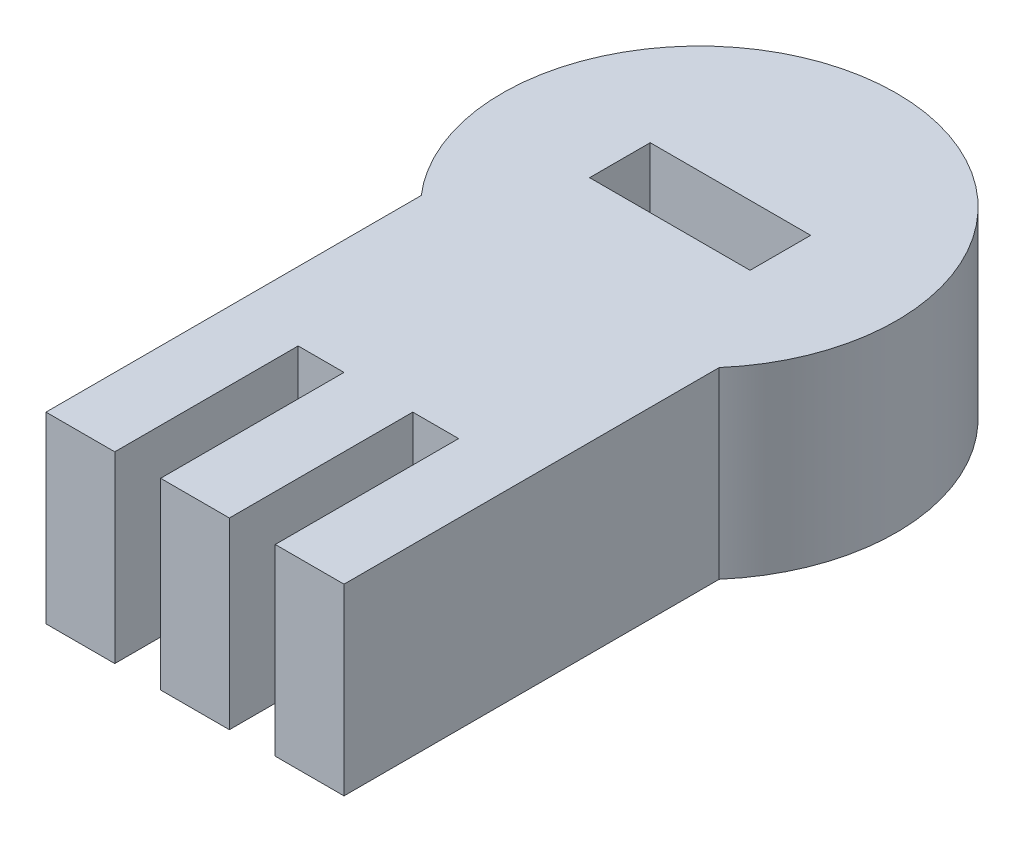
ISO-10303-21;
HEADER;
FILE_DESCRIPTION(('STEP AP214'),'2;1');
FILE_NAME('part.step','',(''),(''),'','','');
FILE_SCHEMA(('AUTOMOTIVE_DESIGN { 1 0 10303 214 1 1 1 1 }'));
ENDSEC;
DATA;
#1=APPLICATION_CONTEXT('core data for automotive mechanical design processes');
#2=APPLICATION_PROTOCOL_DEFINITION('international standard','automotive_design',2000,#1);
#3=PRODUCT_CONTEXT('',#1,'mechanical');
#4=PRODUCT('Part','Part','',(#3));
#5=PRODUCT_RELATED_PRODUCT_CATEGORY('part','',(#4));
#6=PRODUCT_DEFINITION_FORMATION('','',#4);
#7=PRODUCT_DEFINITION_CONTEXT('part definition',#1,'design');
#8=PRODUCT_DEFINITION('design','',#6,#7);
#9=PRODUCT_DEFINITION_SHAPE('','',#8);
#10=(LENGTH_UNIT() NAMED_UNIT(*) SI_UNIT(.MILLI.,.METRE.));
#11=(NAMED_UNIT(*) PLANE_ANGLE_UNIT() SI_UNIT($,.RADIAN.));
#12=(NAMED_UNIT(*) SI_UNIT($,.STERADIAN.) SOLID_ANGLE_UNIT());
#13=UNCERTAINTY_MEASURE_WITH_UNIT(LENGTH_MEASURE(1.E-05),#10,'distance_accuracy_value','');
#14=(GEOMETRIC_REPRESENTATION_CONTEXT(3) GLOBAL_UNCERTAINTY_ASSIGNED_CONTEXT((#13)) GLOBAL_UNIT_ASSIGNED_CONTEXT((#10,
#11,#12)) REPRESENTATION_CONTEXT('',''));
#15=CARTESIAN_POINT('',(0.,0.,0.));
#16=DIRECTION('',(0.,0.,1.));
#17=DIRECTION('',(1.,0.,0.));
#18=AXIS2_PLACEMENT_3D('',#15,#16,#17);
#19=CARTESIAN_POINT('',(3.25,4.,-7.));
#20=DIRECTION('',(0.,1.,0.));
#21=DIRECTION('',(0.,0.,1.));
#22=AXIS2_PLACEMENT_3D('',#19,#20,#21);
#23=PLANE('',#22);
#24=DIRECTION('',(0.,0.,1.));
#25=VECTOR('',#24,1.);
#26=CARTESIAN_POINT('',(0.,4.,-4.18441835493978));
#27=LINE('',#26,#25);
#28=CARTESIAN_POINT('',(0.,4.,-4.18441835493979));
#29=VERTEX_POINT('',#28);
#30=CARTESIAN_POINT('',(0.,4.,4.));
#31=VERTEX_POINT('',#30);
#32=EDGE_CURVE('E181',#29,#31,#27,.T.);
#33=ORIENTED_EDGE('',*,*,#32,.T.);
#34=DIRECTION('',(1.,0.,0.));
#35=VECTOR('',#34,1.);
#36=CARTESIAN_POINT('',(0.,4.,4.));
#37=LINE('',#36,#35);
#38=CARTESIAN_POINT('',(1.5,4.,4.));
#39=VERTEX_POINT('',#38);
#40=EDGE_CURVE('E183',#31,#39,#37,.T.);
#41=ORIENTED_EDGE('',*,*,#40,.T.);
#42=DIRECTION('',(0.,0.,-1.));
#43=VECTOR('',#42,1.);
#44=CARTESIAN_POINT('',(1.5,4.,4.));
#45=LINE('',#44,#43);
#46=CARTESIAN_POINT('',(1.5,4.,0.));
#47=VERTEX_POINT('',#46);
#48=EDGE_CURVE('E186',#39,#47,#45,.T.);
#49=ORIENTED_EDGE('',*,*,#48,.T.);
#50=DIRECTION('',(1.,0.,0.));
#51=VECTOR('',#50,1.);
#52=CARTESIAN_POINT('',(1.5,4.,0.));
#53=LINE('',#52,#51);
#54=CARTESIAN_POINT('',(2.5,4.,0.));
#55=VERTEX_POINT('',#54);
#56=EDGE_CURVE('E188',#47,#55,#53,.T.);
#57=ORIENTED_EDGE('',*,*,#56,.T.);
#58=DIRECTION('',(0.,0.,1.));
#59=VECTOR('',#58,1.);
#60=CARTESIAN_POINT('',(2.5,4.,0.));
#61=LINE('',#60,#59);
#62=CARTESIAN_POINT('',(2.5,4.,4.));
#63=VERTEX_POINT('',#62);
#64=EDGE_CURVE('E190',#55,#63,#61,.T.);
#65=ORIENTED_EDGE('',*,*,#64,.T.);
#66=DIRECTION('',(1.,0.,0.));
#67=VECTOR('',#66,1.);
#68=CARTESIAN_POINT('',(2.5,4.,4.));
#69=LINE('',#68,#67);
#70=CARTESIAN_POINT('',(4.,4.,4.));
#71=VERTEX_POINT('',#70);
#72=EDGE_CURVE('E192',#63,#71,#69,.T.);
#73=ORIENTED_EDGE('',*,*,#72,.T.);
#74=DIRECTION('',(0.,0.,-1.));
#75=VECTOR('',#74,1.);
#76=CARTESIAN_POINT('',(4.,4.,4.));
#77=LINE('',#76,#75);
#78=CARTESIAN_POINT('',(4.,4.,0.));
#79=VERTEX_POINT('',#78);
#80=EDGE_CURVE('E194',#71,#79,#77,.T.);
#81=ORIENTED_EDGE('',*,*,#80,.T.);
#82=DIRECTION('',(1.,0.,0.));
#83=VECTOR('',#82,1.);
#84=CARTESIAN_POINT('',(4.,4.,0.));
#85=LINE('',#84,#83);
#86=CARTESIAN_POINT('',(5.,4.,0.));
#87=VERTEX_POINT('',#86);
#88=EDGE_CURVE('E196',#79,#87,#85,.T.);
#89=ORIENTED_EDGE('',*,*,#88,.T.);
#90=DIRECTION('',(0.,0.,1.));
#91=VECTOR('',#90,1.);
#92=CARTESIAN_POINT('',(5.,4.,0.));
#93=LINE('',#92,#91);
#94=CARTESIAN_POINT('',(5.,4.,4.));
#95=VERTEX_POINT('',#94);
#96=EDGE_CURVE('E198',#87,#95,#93,.T.);
#97=ORIENTED_EDGE('',*,*,#96,.T.);
#98=DIRECTION('',(1.,0.,0.));
#99=VECTOR('',#98,1.);
#100=CARTESIAN_POINT('',(5.,4.,4.));
#101=LINE('',#100,#99);
#102=CARTESIAN_POINT('',(6.5,4.,4.));
#103=VERTEX_POINT('',#102);
#104=EDGE_CURVE('E200',#95,#103,#101,.T.);
#105=ORIENTED_EDGE('',*,*,#104,.T.);
#106=DIRECTION('',(0.,0.,-1.));
#107=VECTOR('',#106,1.);
#108=CARTESIAN_POINT('',(6.5,4.,4.));
#109=LINE('',#108,#107);
#110=CARTESIAN_POINT('',(6.5,4.,-4.18441835493978));
#111=VERTEX_POINT('',#110);
#112=EDGE_CURVE('E202',#103,#111,#109,.T.);
#113=ORIENTED_EDGE('',*,*,#112,.T.);
#114=CARTESIAN_POINT('',(3.25,4.,-7.));
#115=DIRECTION('',(0.,1.,0.));
#116=DIRECTION('',(0.,0.,1.));
#117=AXIS2_PLACEMENT_3D('',#114,#115,#116);
#118=CIRCLE('',#117,4.3);
#119=EDGE_CURVE('E204',#111,#29,#118,.T.);
#120=ORIENTED_EDGE('',*,*,#119,.T.);
#121=EDGE_LOOP('',(#33,#41,#49,#57,#65,#73,#81,#89,#97,#105,#113,#120));
#122=FACE_BOUND('',#121,.T.);
#123=DIRECTION('',(0.,0.,1.));
#124=VECTOR('',#123,1.);
#125=CARTESIAN_POINT('',(1.5,4.,-7.67891168532453));
#126=LINE('',#125,#124);
#127=CARTESIAN_POINT('',(1.5,4.,-7.67891168532453));
#128=VERTEX_POINT('',#127);
#129=CARTESIAN_POINT('',(1.5,4.,-6.35668293751779));
#130=VERTEX_POINT('',#129);
#131=EDGE_CURVE('E153',#128,#130,#126,.T.);
#132=ORIENTED_EDGE('',*,*,#131,.F.);
#133=DIRECTION('',(-1.,0.,0.));
#134=VECTOR('',#133,1.);
#135=CARTESIAN_POINT('',(5.,4.,-7.67891168532453));
#136=LINE('',#135,#134);
#137=CARTESIAN_POINT('',(5.,4.,-7.67891168532453));
#138=VERTEX_POINT('',#137);
#139=EDGE_CURVE('E145',#138,#128,#136,.T.);
#140=ORIENTED_EDGE('',*,*,#139,.F.);
#141=DIRECTION('',(0.,0.,-1.));
#142=VECTOR('',#141,1.);
#143=CARTESIAN_POINT('',(5.,4.,-6.35668293751779));
#144=LINE('',#143,#142);
#145=CARTESIAN_POINT('',(5.,4.,-6.35668293751779));
#146=VERTEX_POINT('',#145);
#147=EDGE_CURVE('E167',#146,#138,#144,.T.);
#148=ORIENTED_EDGE('',*,*,#147,.F.);
#149=DIRECTION('',(1.,0.,0.));
#150=VECTOR('',#149,1.);
#151=CARTESIAN_POINT('',(1.5,4.,-6.35668293751779));
#152=LINE('',#151,#150);
#153=EDGE_CURVE('E165',#130,#146,#152,.T.);
#154=ORIENTED_EDGE('',*,*,#153,.F.);
#155=EDGE_LOOP('',(#132,#140,#148,#154));
#156=FACE_BOUND('',#155,.T.);
#157=ADVANCED_FACE('F32',(#122,#156),#23,.T.);
#158=CARTESIAN_POINT('',(3.25,0.,-7.));
#159=DIRECTION('',(0.,1.,0.));
#160=DIRECTION('',(0.,0.,1.));
#161=AXIS2_PLACEMENT_3D('',#158,#159,#160);
#162=PLANE('',#161);
#163=DIRECTION('',(0.,0.,1.));
#164=VECTOR('',#163,1.);
#165=CARTESIAN_POINT('',(0.,0.,0.));
#166=LINE('',#165,#164);
#167=CARTESIAN_POINT('',(0.,0.,-4.18441835493979));
#168=VERTEX_POINT('',#167);
#169=CARTESIAN_POINT('',(0.,0.,4.));
#170=VERTEX_POINT('',#169);
#171=EDGE_CURVE('E161',#168,#170,#166,.T.);
#172=ORIENTED_EDGE('',*,*,#171,.F.);
#173=CARTESIAN_POINT('',(3.25,0.,-7.));
#174=DIRECTION('',(0.,1.,0.));
#175=DIRECTION('',(0.,0.,1.));
#176=AXIS2_PLACEMENT_3D('',#173,#174,#175);
#177=CIRCLE('',#176,4.3);
#178=CARTESIAN_POINT('',(6.5,0.,-4.18441835493978));
#179=VERTEX_POINT('',#178);
#180=EDGE_CURVE('E184',#179,#168,#177,.T.);
#181=ORIENTED_EDGE('',*,*,#180,.F.);
#182=DIRECTION('',(0.,0.,-1.));
#183=VECTOR('',#182,1.);
#184=CARTESIAN_POINT('',(6.5,0.,0.));
#185=LINE('',#184,#183);
#186=CARTESIAN_POINT('',(6.5,0.,4.));
#187=VERTEX_POINT('',#186);
#188=EDGE_CURVE('E227',#187,#179,#185,.T.);
#189=ORIENTED_EDGE('',*,*,#188,.F.);
#190=DIRECTION('',(1.,0.,0.));
#191=VECTOR('',#190,1.);
#192=CARTESIAN_POINT('',(5.,0.,4.));
#193=LINE('',#192,#191);
#194=CARTESIAN_POINT('',(5.,0.,4.));
#195=VERTEX_POINT('',#194);
#196=EDGE_CURVE('E224',#195,#187,#193,.T.);
#197=ORIENTED_EDGE('',*,*,#196,.F.);
#198=DIRECTION('',(0.,0.,1.));
#199=VECTOR('',#198,1.);
#200=CARTESIAN_POINT('',(5.,0.,0.));
#201=LINE('',#200,#199);
#202=CARTESIAN_POINT('',(5.,0.,0.));
#203=VERTEX_POINT('',#202);
#204=EDGE_CURVE('E222',#203,#195,#201,.T.);
#205=ORIENTED_EDGE('',*,*,#204,.F.);
#206=DIRECTION('',(1.,0.,0.));
#207=VECTOR('',#206,1.);
#208=CARTESIAN_POINT('',(4.,0.,0.));
#209=LINE('',#208,#207);
#210=CARTESIAN_POINT('',(4.,0.,0.));
#211=VERTEX_POINT('',#210);
#212=EDGE_CURVE('E220',#211,#203,#209,.T.);
#213=ORIENTED_EDGE('',*,*,#212,.F.);
#214=DIRECTION('',(0.,0.,-1.));
#215=VECTOR('',#214,1.);
#216=CARTESIAN_POINT('',(4.,0.,4.));
#217=LINE('',#216,#215);
#218=CARTESIAN_POINT('',(4.,0.,4.));
#219=VERTEX_POINT('',#218);
#220=EDGE_CURVE('E218',#219,#211,#217,.T.);
#221=ORIENTED_EDGE('',*,*,#220,.F.);
#222=DIRECTION('',(1.,0.,0.));
#223=VECTOR('',#222,1.);
#224=CARTESIAN_POINT('',(2.5,0.,4.));
#225=LINE('',#224,#223);
#226=CARTESIAN_POINT('',(2.5,0.,4.));
#227=VERTEX_POINT('',#226);
#228=EDGE_CURVE('E216',#227,#219,#225,.T.);
#229=ORIENTED_EDGE('',*,*,#228,.F.);
#230=DIRECTION('',(0.,0.,1.));
#231=VECTOR('',#230,1.);
#232=CARTESIAN_POINT('',(2.5,0.,0.));
#233=LINE('',#232,#231);
#234=CARTESIAN_POINT('',(2.5,0.,0.));
#235=VERTEX_POINT('',#234);
#236=EDGE_CURVE('E214',#235,#227,#233,.T.);
#237=ORIENTED_EDGE('',*,*,#236,.F.);
#238=DIRECTION('',(1.,0.,0.));
#239=VECTOR('',#238,1.);
#240=CARTESIAN_POINT('',(1.5,0.,0.));
#241=LINE('',#240,#239);
#242=CARTESIAN_POINT('',(1.5,0.,0.));
#243=VERTEX_POINT('',#242);
#244=EDGE_CURVE('E212',#243,#235,#241,.T.);
#245=ORIENTED_EDGE('',*,*,#244,.F.);
#246=DIRECTION('',(0.,0.,-1.));
#247=VECTOR('',#246,1.);
#248=CARTESIAN_POINT('',(1.5,0.,4.));
#249=LINE('',#248,#247);
#250=CARTESIAN_POINT('',(1.5,0.,4.));
#251=VERTEX_POINT('',#250);
#252=EDGE_CURVE('E210',#251,#243,#249,.T.);
#253=ORIENTED_EDGE('',*,*,#252,.F.);
#254=DIRECTION('',(1.,0.,0.));
#255=VECTOR('',#254,1.);
#256=CARTESIAN_POINT('',(0.,0.,4.));
#257=LINE('',#256,#255);
#258=EDGE_CURVE('E208',#170,#251,#257,.T.);
#259=ORIENTED_EDGE('',*,*,#258,.F.);
#260=EDGE_LOOP('',(#172,#181,#189,#197,#205,#213,#221,#229,#237,#245,#253,#259));
#261=FACE_BOUND('',#260,.T.);
#262=DIRECTION('',(-1.,0.,0.));
#263=VECTOR('',#262,1.);
#264=CARTESIAN_POINT('',(5.,0.,-7.67891168532453));
#265=LINE('',#264,#263);
#266=CARTESIAN_POINT('',(5.,0.,-7.67891168532453));
#267=VERTEX_POINT('',#266);
#268=CARTESIAN_POINT('',(1.5,0.,-7.67891168532453));
#269=VERTEX_POINT('',#268);
#270=EDGE_CURVE('E55',#267,#269,#265,.T.);
#271=ORIENTED_EDGE('',*,*,#270,.T.);
#272=DIRECTION('',(0.,0.,1.));
#273=VECTOR('',#272,1.);
#274=CARTESIAN_POINT('',(1.5,0.,-7.67891168532453));
#275=LINE('',#274,#273);
#276=CARTESIAN_POINT('',(1.5,0.,-6.35668293751779));
#277=VERTEX_POINT('',#276);
#278=EDGE_CURVE('E160',#269,#277,#275,.T.);
#279=ORIENTED_EDGE('',*,*,#278,.T.);
#280=DIRECTION('',(1.,0.,0.));
#281=VECTOR('',#280,1.);
#282=CARTESIAN_POINT('',(1.5,0.,-6.35668293751779));
#283=LINE('',#282,#281);
#284=CARTESIAN_POINT('',(5.,0.,-6.35668293751779));
#285=VERTEX_POINT('',#284);
#286=EDGE_CURVE('E173',#277,#285,#283,.T.);
#287=ORIENTED_EDGE('',*,*,#286,.T.);
#288=DIRECTION('',(0.,0.,-1.));
#289=VECTOR('',#288,1.);
#290=CARTESIAN_POINT('',(5.,0.,-6.35668293751779));
#291=LINE('',#290,#289);
#292=EDGE_CURVE('E154',#285,#267,#291,.T.);
#293=ORIENTED_EDGE('',*,*,#292,.T.);
#294=EDGE_LOOP('',(#271,#279,#287,#293));
#295=FACE_BOUND('',#294,.T.);
#296=ADVANCED_FACE('F271',(#261,#295),#162,.F.);
#297=CARTESIAN_POINT('',(0.,4.,0.));
#298=DIRECTION('',(1.,0.,0.));
#299=DIRECTION('',(0.,0.,-1.));
#300=AXIS2_PLACEMENT_3D('',#297,#298,#299);
#301=PLANE('',#300);
#302=ORIENTED_EDGE('',*,*,#171,.T.);
#303=DIRECTION('',(0.,-1.,0.));
#304=VECTOR('',#303,1.);
#305=CARTESIAN_POINT('',(0.,4.,4.));
#306=LINE('',#305,#304);
#307=EDGE_CURVE('E11',#31,#170,#306,.T.);
#308=ORIENTED_EDGE('',*,*,#307,.F.);
#309=ORIENTED_EDGE('',*,*,#32,.F.);
#310=DIRECTION('',(0.,-1.,0.));
#311=VECTOR('',#310,1.);
#312=CARTESIAN_POINT('',(0.,4.,-4.18441835493979));
#313=LINE('',#312,#311);
#314=EDGE_CURVE('E206',#29,#168,#313,.T.);
#315=ORIENTED_EDGE('',*,*,#314,.T.);
#316=EDGE_LOOP('',(#302,#308,#309,#315));
#317=FACE_BOUND('',#316,.T.);
#318=ADVANCED_FACE('F34',(#317),#301,.F.);
#319=CARTESIAN_POINT('',(0.,4.,4.));
#320=DIRECTION('',(0.,0.,-1.));
#321=DIRECTION('',(-1.,0.,0.));
#322=AXIS2_PLACEMENT_3D('',#319,#320,#321);
#323=PLANE('',#322);
#324=ORIENTED_EDGE('',*,*,#258,.T.);
#325=DIRECTION('',(0.,-1.,0.));
#326=VECTOR('',#325,1.);
#327=CARTESIAN_POINT('',(1.5,4.,4.));
#328=LINE('',#327,#326);
#329=EDGE_CURVE('E40',#39,#251,#328,.T.);
#330=ORIENTED_EDGE('',*,*,#329,.F.);
#331=ORIENTED_EDGE('',*,*,#40,.F.);
#332=ORIENTED_EDGE('',*,*,#307,.T.);
#333=EDGE_LOOP('',(#324,#330,#331,#332));
#334=FACE_BOUND('',#333,.T.);
#335=ADVANCED_FACE('F288',(#334),#323,.F.);
#336=CARTESIAN_POINT('',(1.5,4.,4.));
#337=DIRECTION('',(-1.,0.,0.));
#338=DIRECTION('',(0.,0.,1.));
#339=AXIS2_PLACEMENT_3D('',#336,#337,#338);
#340=PLANE('',#339);
#341=ORIENTED_EDGE('',*,*,#252,.T.);
#342=DIRECTION('',(0.,-1.,0.));
#343=VECTOR('',#342,1.);
#344=CARTESIAN_POINT('',(1.5,4.,0.));
#345=LINE('',#344,#343);
#346=EDGE_CURVE('E257',#47,#243,#345,.T.);
#347=ORIENTED_EDGE('',*,*,#346,.F.);
#348=ORIENTED_EDGE('',*,*,#48,.F.);
#349=ORIENTED_EDGE('',*,*,#329,.T.);
#350=EDGE_LOOP('',(#341,#347,#348,#349));
#351=FACE_BOUND('',#350,.T.);
#352=ADVANCED_FACE('F264',(#351),#340,.F.);
#353=CARTESIAN_POINT('',(1.5,4.,0.));
#354=DIRECTION('',(0.,0.,-1.));
#355=DIRECTION('',(-1.,0.,0.));
#356=AXIS2_PLACEMENT_3D('',#353,#354,#355);
#357=PLANE('',#356);
#358=ORIENTED_EDGE('',*,*,#244,.T.);
#359=DIRECTION('',(0.,-1.,0.));
#360=VECTOR('',#359,1.);
#361=CARTESIAN_POINT('',(2.5,4.,0.));
#362=LINE('',#361,#360);
#363=EDGE_CURVE('E254',#55,#235,#362,.T.);
#364=ORIENTED_EDGE('',*,*,#363,.F.);
#365=ORIENTED_EDGE('',*,*,#56,.F.);
#366=ORIENTED_EDGE('',*,*,#346,.T.);
#367=EDGE_LOOP('',(#358,#364,#365,#366));
#368=FACE_BOUND('',#367,.T.);
#369=ADVANCED_FACE('F277',(#368),#357,.F.);
#370=CARTESIAN_POINT('',(2.5,4.,0.));
#371=DIRECTION('',(1.,0.,0.));
#372=DIRECTION('',(0.,0.,-1.));
#373=AXIS2_PLACEMENT_3D('',#370,#371,#372);
#374=PLANE('',#373);
#375=ORIENTED_EDGE('',*,*,#236,.T.);
#376=DIRECTION('',(0.,-1.,0.));
#377=VECTOR('',#376,1.);
#378=CARTESIAN_POINT('',(2.5,4.,4.));
#379=LINE('',#378,#377);
#380=EDGE_CURVE('E251',#63,#227,#379,.T.);
#381=ORIENTED_EDGE('',*,*,#380,.F.);
#382=ORIENTED_EDGE('',*,*,#64,.F.);
#383=ORIENTED_EDGE('',*,*,#363,.T.);
#384=EDGE_LOOP('',(#375,#381,#382,#383));
#385=FACE_BOUND('',#384,.T.);
#386=ADVANCED_FACE('F281',(#385),#374,.F.);
#387=CARTESIAN_POINT('',(2.5,4.,4.));
#388=DIRECTION('',(0.,0.,-1.));
#389=DIRECTION('',(-1.,0.,0.));
#390=AXIS2_PLACEMENT_3D('',#387,#388,#389);
#391=PLANE('',#390);
#392=ORIENTED_EDGE('',*,*,#228,.T.);
#393=DIRECTION('',(0.,-1.,0.));
#394=VECTOR('',#393,1.);
#395=CARTESIAN_POINT('',(4.,4.,4.));
#396=LINE('',#395,#394);
#397=EDGE_CURVE('E248',#71,#219,#396,.T.);
#398=ORIENTED_EDGE('',*,*,#397,.F.);
#399=ORIENTED_EDGE('',*,*,#72,.F.);
#400=ORIENTED_EDGE('',*,*,#380,.T.);
#401=EDGE_LOOP('',(#392,#398,#399,#400));
#402=FACE_BOUND('',#401,.T.);
#403=ADVANCED_FACE('F320',(#402),#391,.F.);
#404=CARTESIAN_POINT('',(4.,4.,4.));
#405=DIRECTION('',(-1.,0.,0.));
#406=DIRECTION('',(0.,0.,1.));
#407=AXIS2_PLACEMENT_3D('',#404,#405,#406);
#408=PLANE('',#407);
#409=ORIENTED_EDGE('',*,*,#220,.T.);
#410=DIRECTION('',(0.,-1.,0.));
#411=VECTOR('',#410,1.);
#412=CARTESIAN_POINT('',(4.,4.,0.));
#413=LINE('',#412,#411);
#414=EDGE_CURVE('E245',#79,#211,#413,.T.);
#415=ORIENTED_EDGE('',*,*,#414,.F.);
#416=ORIENTED_EDGE('',*,*,#80,.F.);
#417=ORIENTED_EDGE('',*,*,#397,.T.);
#418=EDGE_LOOP('',(#409,#415,#416,#417));
#419=FACE_BOUND('',#418,.T.);
#420=ADVANCED_FACE('F318',(#419),#408,.F.);
#421=CARTESIAN_POINT('',(4.,4.,0.));
#422=DIRECTION('',(0.,0.,-1.));
#423=DIRECTION('',(-1.,0.,0.));
#424=AXIS2_PLACEMENT_3D('',#421,#422,#423);
#425=PLANE('',#424);
#426=ORIENTED_EDGE('',*,*,#212,.T.);
#427=DIRECTION('',(0.,-1.,0.));
#428=VECTOR('',#427,1.);
#429=CARTESIAN_POINT('',(5.,4.,0.));
#430=LINE('',#429,#428);
#431=EDGE_CURVE('E242',#87,#203,#430,.T.);
#432=ORIENTED_EDGE('',*,*,#431,.F.);
#433=ORIENTED_EDGE('',*,*,#88,.F.);
#434=ORIENTED_EDGE('',*,*,#414,.T.);
#435=EDGE_LOOP('',(#426,#432,#433,#434));
#436=FACE_BOUND('',#435,.T.);
#437=ADVANCED_FACE('F313',(#436),#425,.F.);
#438=CARTESIAN_POINT('',(5.,4.,0.));
#439=DIRECTION('',(1.,0.,0.));
#440=DIRECTION('',(0.,0.,-1.));
#441=AXIS2_PLACEMENT_3D('',#438,#439,#440);
#442=PLANE('',#441);
#443=ORIENTED_EDGE('',*,*,#204,.T.);
#444=DIRECTION('',(0.,-1.,0.));
#445=VECTOR('',#444,1.);
#446=CARTESIAN_POINT('',(5.,4.,4.));
#447=LINE('',#446,#445);
#448=EDGE_CURVE('E239',#95,#195,#447,.T.);
#449=ORIENTED_EDGE('',*,*,#448,.F.);
#450=ORIENTED_EDGE('',*,*,#96,.F.);
#451=ORIENTED_EDGE('',*,*,#431,.T.);
#452=EDGE_LOOP('',(#443,#449,#450,#451));
#453=FACE_BOUND('',#452,.T.);
#454=ADVANCED_FACE('F308',(#453),#442,.F.);
#455=CARTESIAN_POINT('',(5.,4.,4.));
#456=DIRECTION('',(0.,0.,-1.));
#457=DIRECTION('',(-1.,0.,0.));
#458=AXIS2_PLACEMENT_3D('',#455,#456,#457);
#459=PLANE('',#458);
#460=ORIENTED_EDGE('',*,*,#196,.T.);
#461=DIRECTION('',(0.,-1.,0.));
#462=VECTOR('',#461,1.);
#463=CARTESIAN_POINT('',(6.5,4.,4.));
#464=LINE('',#463,#462);
#465=EDGE_CURVE('E236',#103,#187,#464,.T.);
#466=ORIENTED_EDGE('',*,*,#465,.F.);
#467=ORIENTED_EDGE('',*,*,#104,.F.);
#468=ORIENTED_EDGE('',*,*,#448,.T.);
#469=EDGE_LOOP('',(#460,#466,#467,#468));
#470=FACE_BOUND('',#469,.T.);
#471=ADVANCED_FACE('F303',(#470),#459,.F.);
#472=CARTESIAN_POINT('',(6.5,4.,0.));
#473=DIRECTION('',(-1.,0.,0.));
#474=DIRECTION('',(0.,0.,1.));
#475=AXIS2_PLACEMENT_3D('',#472,#473,#474);
#476=PLANE('',#475);
#477=ORIENTED_EDGE('',*,*,#188,.T.);
#478=DIRECTION('',(0.,-1.,0.));
#479=VECTOR('',#478,1.);
#480=CARTESIAN_POINT('',(6.5,4.,-4.18441835493978));
#481=LINE('',#480,#479);
#482=EDGE_CURVE('E233',#111,#179,#481,.T.);
#483=ORIENTED_EDGE('',*,*,#482,.F.);
#484=ORIENTED_EDGE('',*,*,#112,.F.);
#485=ORIENTED_EDGE('',*,*,#465,.T.);
#486=EDGE_LOOP('',(#477,#483,#484,#485));
#487=FACE_BOUND('',#486,.T.);
#488=ADVANCED_FACE('F298',(#487),#476,.F.);
#489=CARTESIAN_POINT('',(3.25,4.,-7.));
#490=DIRECTION('',(0.,-1.,0.));
#491=DIRECTION('',(0.,0.,-1.));
#492=AXIS2_PLACEMENT_3D('',#489,#490,#491);
#493=CYLINDRICAL_SURFACE('',#492,4.3);
#494=ORIENTED_EDGE('',*,*,#180,.T.);
#495=ORIENTED_EDGE('',*,*,#314,.F.);
#496=ORIENTED_EDGE('',*,*,#119,.F.);
#497=ORIENTED_EDGE('',*,*,#482,.T.);
#498=EDGE_LOOP('',(#494,#495,#496,#497));
#499=FACE_BOUND('',#498,.T.);
#500=ADVANCED_FACE('F293',(#499),#493,.T.);
#501=CARTESIAN_POINT('',(5.,4.,-7.67891168532453));
#502=DIRECTION('',(0.,0.,1.));
#503=DIRECTION('',(1.,0.,0.));
#504=AXIS2_PLACEMENT_3D('',#501,#502,#503);
#505=PLANE('',#504);
#506=ORIENTED_EDGE('',*,*,#270,.F.);
#507=DIRECTION('',(0.,-1.,0.));
#508=VECTOR('',#507,1.);
#509=CARTESIAN_POINT('',(5.,4.,-7.67891168532453));
#510=LINE('',#509,#508);
#511=EDGE_CURVE('E149',#138,#267,#510,.T.);
#512=ORIENTED_EDGE('',*,*,#511,.F.);
#513=ORIENTED_EDGE('',*,*,#139,.T.);
#514=DIRECTION('',(0.,-1.,0.));
#515=VECTOR('',#514,1.);
#516=CARTESIAN_POINT('',(1.5,4.,-7.67891168532453));
#517=LINE('',#516,#515);
#518=EDGE_CURVE('E148',#128,#269,#517,.T.);
#519=ORIENTED_EDGE('',*,*,#518,.T.);
#520=EDGE_LOOP('',(#506,#512,#513,#519));
#521=FACE_BOUND('',#520,.T.);
#522=ADVANCED_FACE('F147',(#521),#505,.T.);
#523=CARTESIAN_POINT('',(1.5,4.,-7.67891168532453));
#524=DIRECTION('',(1.,0.,0.));
#525=DIRECTION('',(0.,0.,-1.));
#526=AXIS2_PLACEMENT_3D('',#523,#524,#525);
#527=PLANE('',#526);
#528=ORIENTED_EDGE('',*,*,#278,.F.);
#529=ORIENTED_EDGE('',*,*,#518,.F.);
#530=ORIENTED_EDGE('',*,*,#131,.T.);
#531=DIRECTION('',(0.,-1.,0.));
#532=VECTOR('',#531,1.);
#533=CARTESIAN_POINT('',(1.5,4.,-6.35668293751779));
#534=LINE('',#533,#532);
#535=EDGE_CURVE('E162',#130,#277,#534,.T.);
#536=ORIENTED_EDGE('',*,*,#535,.T.);
#537=EDGE_LOOP('',(#528,#529,#530,#536));
#538=FACE_BOUND('',#537,.T.);
#539=ADVANCED_FACE('F157',(#538),#527,.T.);
#540=CARTESIAN_POINT('',(1.5,4.,-6.35668293751779));
#541=DIRECTION('',(0.,0.,-1.));
#542=DIRECTION('',(-1.,0.,0.));
#543=AXIS2_PLACEMENT_3D('',#540,#541,#542);
#544=PLANE('',#543);
#545=ORIENTED_EDGE('',*,*,#286,.F.);
#546=ORIENTED_EDGE('',*,*,#535,.F.);
#547=ORIENTED_EDGE('',*,*,#153,.T.);
#548=DIRECTION('',(0.,-1.,0.));
#549=VECTOR('',#548,1.);
#550=CARTESIAN_POINT('',(5.,4.,-6.35668293751779));
#551=LINE('',#550,#549);
#552=EDGE_CURVE('E47',#146,#285,#551,.T.);
#553=ORIENTED_EDGE('',*,*,#552,.T.);
#554=EDGE_LOOP('',(#545,#546,#547,#553));
#555=FACE_BOUND('',#554,.T.);
#556=ADVANCED_FACE('F378',(#555),#544,.T.);
#557=CARTESIAN_POINT('',(5.,4.,-6.35668293751779));
#558=DIRECTION('',(-1.,0.,0.));
#559=DIRECTION('',(0.,0.,1.));
#560=AXIS2_PLACEMENT_3D('',#557,#558,#559);
#561=PLANE('',#560);
#562=ORIENTED_EDGE('',*,*,#292,.F.);
#563=ORIENTED_EDGE('',*,*,#552,.F.);
#564=ORIENTED_EDGE('',*,*,#147,.T.);
#565=ORIENTED_EDGE('',*,*,#511,.T.);
#566=EDGE_LOOP('',(#562,#563,#564,#565));
#567=FACE_BOUND('',#566,.T.);
#568=ADVANCED_FACE('F384',(#567),#561,.T.);
#569=CLOSED_SHELL('',(#157,#296,#318,#335,#352,#369,#386,#403,#420,#437,#454,#471,#488,#500,
#522,#539,#556,#568));
#570=MANIFOLD_SOLID_BREP('B2',#569);
#571=ADVANCED_BREP_SHAPE_REPRESENTATION('',(#18,#570),#14);
#572=SHAPE_DEFINITION_REPRESENTATION(#9,#571);
ENDSEC;
END-ISO-10303-21;
